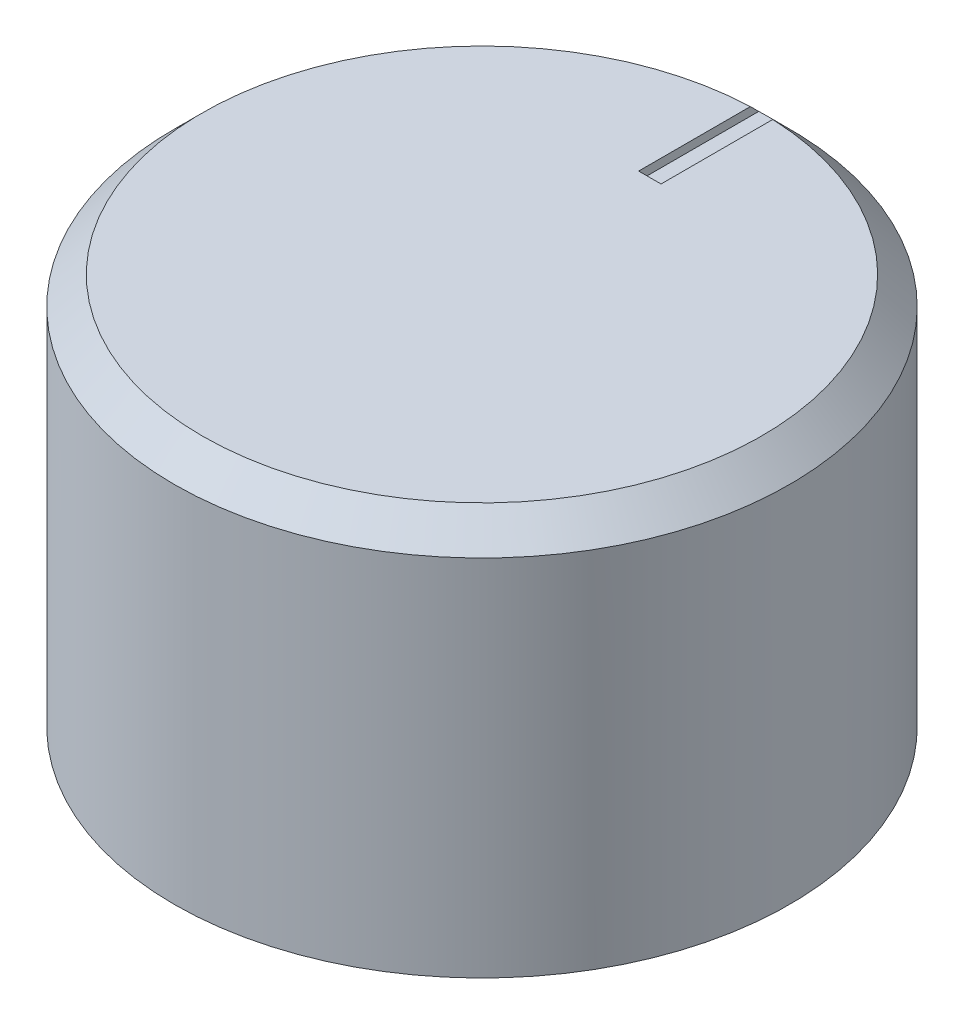
ISO-10303-21;
HEADER;
FILE_DESCRIPTION(('STEP AP214'),'2;1');
FILE_NAME('part.step','',(''),(''),'','','');
FILE_SCHEMA(('AUTOMOTIVE_DESIGN { 1 0 10303 214 1 1 1 1 }'));
ENDSEC;
DATA;
#1=APPLICATION_CONTEXT('core data for automotive mechanical design processes');
#2=APPLICATION_PROTOCOL_DEFINITION('international standard','automotive_design',2000,#1);
#3=PRODUCT_CONTEXT('',#1,'mechanical');
#4=PRODUCT('Part','Part','',(#3));
#5=PRODUCT_RELATED_PRODUCT_CATEGORY('part','',(#4));
#6=PRODUCT_DEFINITION_FORMATION('','',#4);
#7=PRODUCT_DEFINITION_CONTEXT('part definition',#1,'design');
#8=PRODUCT_DEFINITION('design','',#6,#7);
#9=PRODUCT_DEFINITION_SHAPE('','',#8);
#10=(LENGTH_UNIT() NAMED_UNIT(*) SI_UNIT(.MILLI.,.METRE.));
#11=(NAMED_UNIT(*) PLANE_ANGLE_UNIT() SI_UNIT($,.RADIAN.));
#12=(NAMED_UNIT(*) SI_UNIT($,.STERADIAN.) SOLID_ANGLE_UNIT());
#13=UNCERTAINTY_MEASURE_WITH_UNIT(LENGTH_MEASURE(1.E-05),#10,'distance_accuracy_value','');
#14=(GEOMETRIC_REPRESENTATION_CONTEXT(3) GLOBAL_UNCERTAINTY_ASSIGNED_CONTEXT((#13)) GLOBAL_UNIT_ASSIGNED_CONTEXT((#10,
#11,#12)) REPRESENTATION_CONTEXT('',''));
#15=CARTESIAN_POINT('',(0.,0.,0.));
#16=DIRECTION('',(0.,0.,1.));
#17=DIRECTION('',(1.,0.,0.));
#18=AXIS2_PLACEMENT_3D('',#15,#16,#17);
#19=CARTESIAN_POINT('',(0.,14.,0.));
#20=DIRECTION('',(0.,-1.,0.));
#21=DIRECTION('',(0.,0.,-1.));
#22=AXIS2_PLACEMENT_3D('',#19,#20,#21);
#23=CYLINDRICAL_SURFACE('',#22,11.);
#24=CARTESIAN_POINT('',(0.,13.,0.));
#25=DIRECTION('',(0.,1.,0.));
#26=DIRECTION('',(0.,0.,1.));
#27=AXIS2_PLACEMENT_3D('',#24,#25,#26);
#28=CIRCLE('',#27,11.);
#29=CARTESIAN_POINT('',(0.,13.,11.));
#30=VERTEX_POINT('',#29);
#31=EDGE_CURVE('E113',#30,#30,#28,.F.);
#32=ORIENTED_EDGE('',*,*,#31,.T.);
#33=EDGE_LOOP('',(#32));
#34=FACE_BOUND('',#33,.T.);
#35=CARTESIAN_POINT('',(0.,0.,0.));
#36=DIRECTION('',(0.,1.,0.));
#37=DIRECTION('',(0.,0.,1.));
#38=AXIS2_PLACEMENT_3D('',#35,#36,#37);
#39=CIRCLE('',#38,11.);
#40=CARTESIAN_POINT('',(0.,0.,11.));
#41=VERTEX_POINT('',#40);
#42=EDGE_CURVE('E106',#41,#41,#39,.T.);
#43=ORIENTED_EDGE('',*,*,#42,.T.);
#44=EDGE_LOOP('',(#43));
#45=FACE_BOUND('',#44,.T.);
#46=ADVANCED_FACE('F35',(#34,#45),#23,.T.);
#47=CARTESIAN_POINT('',(0.,14.,0.));
#48=DIRECTION('',(0.,1.,0.));
#49=DIRECTION('',(0.,0.,1.));
#50=AXIS2_PLACEMENT_3D('',#47,#48,#49);
#51=PLANE('',#50);
#52=DIRECTION('',(0.,0.,1.));
#53=VECTOR('',#52,1.);
#54=CARTESIAN_POINT('',(-0.4,14.,-6.));
#55=LINE('',#54,#53);
#56=CARTESIAN_POINT('',(-0.4,14.,-9.99199679743743));
#57=VERTEX_POINT('',#56);
#58=CARTESIAN_POINT('',(-0.4,14.,-6.));
#59=VERTEX_POINT('',#58);
#60=EDGE_CURVE('E90',#57,#59,#55,.T.);
#61=ORIENTED_EDGE('',*,*,#60,.F.);
#62=CARTESIAN_POINT('',(0.,14.,0.));
#63=DIRECTION('',(0.,1.,0.));
#64=DIRECTION('',(0.,0.,1.));
#65=AXIS2_PLACEMENT_3D('',#62,#63,#64);
#66=CIRCLE('',#65,9.99999999999999);
#67=CARTESIAN_POINT('',(0.4,14.,-9.99199679743743));
#68=VERTEX_POINT('',#67);
#69=EDGE_CURVE('E110',#57,#68,#66,.T.);
#70=ORIENTED_EDGE('',*,*,#69,.T.);
#71=DIRECTION('',(0.,0.,-1.));
#72=VECTOR('',#71,1.);
#73=CARTESIAN_POINT('',(0.4,14.,-6.));
#74=LINE('',#73,#72);
#75=CARTESIAN_POINT('',(0.4,14.,-6.));
#76=VERTEX_POINT('',#75);
#77=EDGE_CURVE('E84',#76,#68,#74,.T.);
#78=ORIENTED_EDGE('',*,*,#77,.F.);
#79=DIRECTION('',(1.,0.,0.));
#80=VECTOR('',#79,1.);
#81=CARTESIAN_POINT('',(-0.4,14.,-6.));
#82=LINE('',#81,#80);
#83=EDGE_CURVE('E102',#59,#76,#82,.T.);
#84=ORIENTED_EDGE('',*,*,#83,.F.);
#85=EDGE_LOOP('',(#61,#70,#78,#84));
#86=FACE_BOUND('',#85,.T.);
#87=ADVANCED_FACE('F131',(#86),#51,.T.);
#88=CARTESIAN_POINT('',(0.,0.,0.));
#89=DIRECTION('',(0.,1.,0.));
#90=DIRECTION('',(0.,0.,1.));
#91=AXIS2_PLACEMENT_3D('',#88,#89,#90);
#92=PLANE('',#91);
#93=CARTESIAN_POINT('',(0.,0.,0.));
#94=DIRECTION('',(0.,-1.,0.));
#95=DIRECTION('',(0.,0.,-1.));
#96=AXIS2_PLACEMENT_3D('',#93,#94,#95);
#97=CIRCLE('',#96,3.);
#98=CARTESIAN_POINT('',(0.,0.,-3.));
#99=VERTEX_POINT('',#98);
#100=EDGE_CURVE('E224',#99,#99,#97,.T.);
#101=ORIENTED_EDGE('',*,*,#100,.F.);
#102=EDGE_LOOP('',(#101));
#103=FACE_BOUND('',#102,.T.);
#104=ORIENTED_EDGE('',*,*,#42,.F.);
#105=EDGE_LOOP('',(#104));
#106=FACE_BOUND('',#105,.T.);
#107=ADVANCED_FACE('F134',(#103,#106),#92,.F.);
#108=CARTESIAN_POINT('',(0.,14.,0.));
#109=DIRECTION('',(0.,-1.,0.));
#110=DIRECTION('',(0.,0.,-1.));
#111=AXIS2_PLACEMENT_3D('',#108,#109,#110);
#112=CONICAL_SURFACE('',#111,9.99999999999999,0.785398163397448);
#113=CARTESIAN_POINT('',(-0.4,7.33933992158831,-16.6558576557432));
#114=CARTESIAN_POINT('',(-0.4,8.40512327026295,-15.5897356057721));
#115=CARTESIAN_POINT('',(-0.4,9.47090505051337,-14.5236119613529));
#116=CARTESIAN_POINT('',(-0.4,11.6023499126508,-12.3912463566722));
#117=CARTESIAN_POINT('',(-0.4,12.668012994556,-11.3250043964288));
#118=CARTESIAN_POINT('',(-0.4,14.2663323149976,-9.72546598139564));
#119=CARTESIAN_POINT('',(-0.4,14.799076278316,-9.19225719027767));
#120=CARTESIAN_POINT('',(-0.4,15.8644614525749,-8.12573703562107));
#121=CARTESIAN_POINT('',(-0.4,16.3971026635225,-7.59242567208947));
#122=CARTESIAN_POINT('',(-0.4,17.4622029776595,-6.5256208272867));
#123=CARTESIAN_POINT('',(-0.4,17.9946620808045,-5.99212734597114));
#124=CARTESIAN_POINT('',(-0.4,18.7930567157961,-5.19159369612233));
#125=CARTESIAN_POINT('',(-0.4,19.0591392892103,-4.92470020969044));
#126=CARTESIAN_POINT('',(-0.4,19.5911313365063,-4.39074070163288));
#127=CARTESIAN_POINT('',(-0.4,19.8570408103588,-4.12367467997814));
#128=CARTESIAN_POINT('',(-0.4,20.1228261536992,-3.85648506213094));
#129=B_SPLINE_CURVE_WITH_KNOTS('',3,(#113,#114,#115,#116,#117,#118,#119,#120,#121,#122,#123,
#124,#125,#126,#127,#128),.UNSPECIFIED.,.F.,.F.,(4,2,2,2,2,2,2,4),(0.,4.52245438184808,
9.04490806988674,11.3061355385756,13.5673628523833,15.8285907178123,16.9592049201091,
18.0898193129072),.UNSPECIFIED.);
#130=CARTESIAN_POINT('',(-0.4,13.7,-10.2922300790451));
#131=VERTEX_POINT('',#130);
#132=EDGE_CURVE('E11',#131,#57,#129,.T.);
#133=ORIENTED_EDGE('',*,*,#132,.F.);
#134=CARTESIAN_POINT('',(0.,13.7,0.));
#135=DIRECTION('',(0.,-1.,0.));
#136=DIRECTION('',(0.,0.,-1.));
#137=AXIS2_PLACEMENT_3D('',#134,#135,#136);
#138=CIRCLE('',#137,10.3);
#139=CARTESIAN_POINT('',(0.4,13.7,-10.2922300790451));
#140=VERTEX_POINT('',#139);
#141=EDGE_CURVE('E60',#140,#131,#138,.F.);
#142=ORIENTED_EDGE('',*,*,#141,.F.);
#143=CARTESIAN_POINT('',(0.4,20.1228261536992,-3.85648506213094));
#144=CARTESIAN_POINT('',(0.4,19.8558688735433,-4.12485258881877));
#145=CARTESIAN_POINT('',(0.4,19.5887865100531,-4.39309556994036));
#146=CARTESIAN_POINT('',(0.4,19.0544475108358,-4.92940782710218));
#147=CARTESIAN_POINT('',(0.4,18.7871908751382,-5.1974771031718));
#148=CARTESIAN_POINT('',(0.4,17.9852733971495,-6.00153745723476));
#149=CARTESIAN_POINT('',(0.4,17.4504648526714,-6.5373811929176));
#150=CARTESIAN_POINT('',(0.4,16.3853611242786,-7.60418259408366));
#151=CARTESIAN_POINT('',(0.4,15.8550675376416,-8.13514185466396));
#152=CARTESIAN_POINT('',(0.4,14.7943786648721,-9.19695891470453));
#153=CARTESIAN_POINT('',(0.4,14.2639833787269,-9.72781671415212));
#154=CARTESIAN_POINT('',(0.4,12.6680127460329,-11.3250046353602));
#155=CARTESIAN_POINT('',(0.4,11.6023494228954,-12.3912468418074));
#156=CARTESIAN_POINT('',(0.4,9.47090456560062,-14.5236124513186));
#157=CARTESIAN_POINT('',(0.4,8.40512303147931,-15.5897358544185));
#158=CARTESIAN_POINT('',(0.4,7.33933992158831,-16.6558576557432));
#159=B_SPLINE_CURVE_WITH_KNOTS('',3,(#143,#144,#145,#146,#147,#148,#149,#150,#151,#152,#153,
#154,#155,#156,#157,#158),.UNSPECIFIED.,.F.,.F.,(4,2,2,2,2,2,2,4),(0.,1.13559918237469,
2.27119817261806,4.54239559492849,6.79365327822079,9.04491124266604,13.5673659647258,
18.0898193125528),.UNSPECIFIED.);
#160=EDGE_CURVE('E48',#68,#140,#159,.T.);
#161=ORIENTED_EDGE('',*,*,#160,.F.);
#162=ORIENTED_EDGE('',*,*,#69,.F.);
#163=EDGE_LOOP('',(#133,#142,#161,#162));
#164=FACE_BOUND('',#163,.T.);
#165=ORIENTED_EDGE('',*,*,#31,.F.);
#166=EDGE_LOOP('',(#165));
#167=FACE_BOUND('',#166,.T.);
#168=ADVANCED_FACE('F37',(#164,#167),#112,.T.);
#169=CARTESIAN_POINT('',(-0.4,13.7,-6.));
#170=DIRECTION('',(-1.,0.,0.));
#171=DIRECTION('',(0.,0.,1.));
#172=AXIS2_PLACEMENT_3D('',#169,#170,#171);
#173=PLANE('',#172);
#174=ORIENTED_EDGE('',*,*,#132,.T.);
#175=ORIENTED_EDGE('',*,*,#60,.T.);
#176=DIRECTION('',(0.,1.,0.));
#177=VECTOR('',#176,1.);
#178=CARTESIAN_POINT('',(-0.4,13.7,-6.));
#179=LINE('',#178,#177);
#180=CARTESIAN_POINT('',(-0.4,13.7,-6.));
#181=VERTEX_POINT('',#180);
#182=EDGE_CURVE('E87',#181,#59,#179,.T.);
#183=ORIENTED_EDGE('',*,*,#182,.F.);
#184=DIRECTION('',(0.,0.,1.));
#185=VECTOR('',#184,1.);
#186=CARTESIAN_POINT('',(-0.4,13.7,-6.));
#187=LINE('',#186,#185);
#188=EDGE_CURVE('E77',#131,#181,#187,.T.);
#189=ORIENTED_EDGE('',*,*,#188,.F.);
#190=EDGE_LOOP('',(#174,#175,#183,#189));
#191=FACE_BOUND('',#190,.T.);
#192=ADVANCED_FACE('F88',(#191),#173,.F.);
#193=CARTESIAN_POINT('',(0.4,13.7,-6.));
#194=DIRECTION('',(1.,0.,0.));
#195=DIRECTION('',(0.,0.,-1.));
#196=AXIS2_PLACEMENT_3D('',#193,#194,#195);
#197=PLANE('',#196);
#198=ORIENTED_EDGE('',*,*,#160,.T.);
#199=DIRECTION('',(0.,0.,-1.));
#200=VECTOR('',#199,1.);
#201=CARTESIAN_POINT('',(0.4,13.7,-6.));
#202=LINE('',#201,#200);
#203=CARTESIAN_POINT('',(0.4,13.7,-6.));
#204=VERTEX_POINT('',#203);
#205=EDGE_CURVE('E55',#204,#140,#202,.T.);
#206=ORIENTED_EDGE('',*,*,#205,.F.);
#207=DIRECTION('',(0.,1.,0.));
#208=VECTOR('',#207,1.);
#209=CARTESIAN_POINT('',(0.4,13.7,-6.));
#210=LINE('',#209,#208);
#211=EDGE_CURVE('E94',#204,#76,#210,.T.);
#212=ORIENTED_EDGE('',*,*,#211,.T.);
#213=ORIENTED_EDGE('',*,*,#77,.T.);
#214=EDGE_LOOP('',(#198,#206,#212,#213));
#215=FACE_BOUND('',#214,.T.);
#216=ADVANCED_FACE('F120',(#215),#197,.F.);
#217=CARTESIAN_POINT('',(-0.4,13.7,-6.));
#218=DIRECTION('',(0.,0.,1.));
#219=DIRECTION('',(1.,0.,0.));
#220=AXIS2_PLACEMENT_3D('',#217,#218,#219);
#221=PLANE('',#220);
#222=ORIENTED_EDGE('',*,*,#83,.T.);
#223=ORIENTED_EDGE('',*,*,#211,.F.);
#224=DIRECTION('',(1.,0.,0.));
#225=VECTOR('',#224,1.);
#226=CARTESIAN_POINT('',(-0.4,13.7,-6.));
#227=LINE('',#226,#225);
#228=EDGE_CURVE('E81',#181,#204,#227,.T.);
#229=ORIENTED_EDGE('',*,*,#228,.F.);
#230=ORIENTED_EDGE('',*,*,#182,.T.);
#231=EDGE_LOOP('',(#222,#223,#229,#230));
#232=FACE_BOUND('',#231,.T.);
#233=ADVANCED_FACE('F96',(#232),#221,.F.);
#234=CARTESIAN_POINT('',(0.,13.7,0.));
#235=DIRECTION('',(0.,-1.,0.));
#236=DIRECTION('',(0.,0.,-1.));
#237=AXIS2_PLACEMENT_3D('',#234,#235,#236);
#238=PLANE('',#237);
#239=ORIENTED_EDGE('',*,*,#141,.T.);
#240=ORIENTED_EDGE('',*,*,#188,.T.);
#241=ORIENTED_EDGE('',*,*,#228,.T.);
#242=ORIENTED_EDGE('',*,*,#205,.T.);
#243=EDGE_LOOP('',(#239,#240,#241,#242));
#244=FACE_BOUND('',#243,.T.);
#245=ADVANCED_FACE('F79',(#244),#238,.F.);
#246=CARTESIAN_POINT('',(0.,10.,0.));
#247=DIRECTION('',(0.,-1.,0.));
#248=DIRECTION('',(0.,0.,-1.));
#249=AXIS2_PLACEMENT_3D('',#246,#247,#248);
#250=CYLINDRICAL_SURFACE('',#249,3.);
#251=CARTESIAN_POINT('',(0.,10.,0.));
#252=DIRECTION('',(0.,-1.,0.));
#253=DIRECTION('',(0.,0.,-1.));
#254=AXIS2_PLACEMENT_3D('',#251,#252,#253);
#255=CIRCLE('',#254,3.);
#256=CARTESIAN_POINT('',(0.,10.,-3.));
#257=VERTEX_POINT('',#256);
#258=EDGE_CURVE('E103',#257,#257,#255,.T.);
#259=ORIENTED_EDGE('',*,*,#258,.F.);
#260=EDGE_LOOP('',(#259));
#261=FACE_BOUND('',#260,.T.);
#262=ORIENTED_EDGE('',*,*,#100,.T.);
#263=EDGE_LOOP('',(#262));
#264=FACE_BOUND('',#263,.T.);
#265=ADVANCED_FACE('F175',(#261,#264),#250,.F.);
#266=CARTESIAN_POINT('',(0.,10.,0.));
#267=DIRECTION('',(0.,-1.,0.));
#268=DIRECTION('',(0.,0.,-1.));
#269=AXIS2_PLACEMENT_3D('',#266,#267,#268);
#270=PLANE('',#269);
#271=ORIENTED_EDGE('',*,*,#258,.T.);
#272=EDGE_LOOP('',(#271));
#273=FACE_BOUND('',#272,.T.);
#274=ADVANCED_FACE('F181',(#273),#270,.T.);
#275=CLOSED_SHELL('',(#46,#87,#107,#168,#192,#216,#233,#245,#265,#274));
#276=MANIFOLD_SOLID_BREP('B2',#275);
#277=ADVANCED_BREP_SHAPE_REPRESENTATION('',(#18,#276),#14);
#278=SHAPE_DEFINITION_REPRESENTATION(#9,#277);
ENDSEC;
END-ISO-10303-21;
